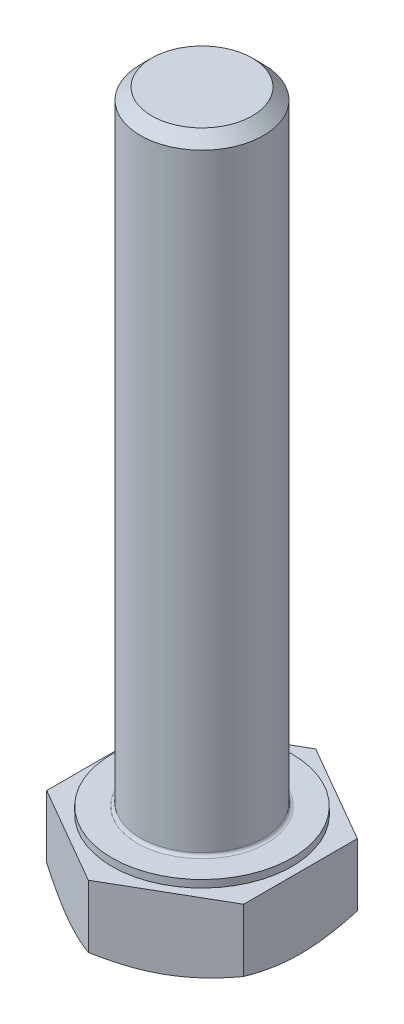
ISO-10303-21;
HEADER;
FILE_DESCRIPTION(('STEP AP214'),'2;1');
FILE_NAME('part.step','',(''),(''),'','','');
FILE_SCHEMA(('AUTOMOTIVE_DESIGN { 1 0 10303 214 1 1 1 1 }'));
ENDSEC;
DATA;
#1=APPLICATION_CONTEXT('core data for automotive mechanical design processes');
#2=APPLICATION_PROTOCOL_DEFINITION('international standard','automotive_design',2000,#1);
#3=PRODUCT_CONTEXT('',#1,'mechanical');
#4=PRODUCT('Part','Part','',(#3));
#5=PRODUCT_RELATED_PRODUCT_CATEGORY('part','',(#4));
#6=PRODUCT_DEFINITION_FORMATION('','',#4);
#7=PRODUCT_DEFINITION_CONTEXT('part definition',#1,'design');
#8=PRODUCT_DEFINITION('design','',#6,#7);
#9=PRODUCT_DEFINITION_SHAPE('','',#8);
#10=(LENGTH_UNIT() NAMED_UNIT(*) SI_UNIT(.MILLI.,.METRE.));
#11=(NAMED_UNIT(*) PLANE_ANGLE_UNIT() SI_UNIT($,.RADIAN.));
#12=(NAMED_UNIT(*) SI_UNIT($,.STERADIAN.) SOLID_ANGLE_UNIT());
#13=UNCERTAINTY_MEASURE_WITH_UNIT(LENGTH_MEASURE(1.E-05),#10,'distance_accuracy_value','');
#14=(GEOMETRIC_REPRESENTATION_CONTEXT(3) GLOBAL_UNCERTAINTY_ASSIGNED_CONTEXT((#13)) GLOBAL_UNIT_ASSIGNED_CONTEXT((#10,
#11,#12)) REPRESENTATION_CONTEXT('',''));
#15=CARTESIAN_POINT('',(0.,0.,0.));
#16=DIRECTION('',(0.,0.,1.));
#17=DIRECTION('',(1.,0.,0.));
#18=AXIS2_PLACEMENT_3D('',#15,#16,#17);
#19=CARTESIAN_POINT('',(8.,-6.4,0.));
#20=DIRECTION('',(0.,1.,0.));
#21=DIRECTION('',(0.,0.,1.));
#22=AXIS2_PLACEMENT_3D('',#19,#20,#21);
#23=PLANE('',#22);
#24=CARTESIAN_POINT('',(0.,-6.40000000000031,0.));
#25=DIRECTION('',(0.,1.,0.));
#26=DIRECTION('',(0.,0.,1.));
#27=AXIS2_PLACEMENT_3D('',#24,#25,#26);
#28=CIRCLE('',#27,8.0000000000382);
#29=CARTESIAN_POINT('',(4.00000000000951,-6.40000000001134,6.92820323029207));
#30=VERTEX_POINT('',#29);
#31=CARTESIAN_POINT('',(8.0000000000191,-6.40000000001134,0.));
#32=VERTEX_POINT('',#31);
#33=EDGE_CURVE('E96',#30,#32,#28,.T.);
#34=ORIENTED_EDGE('',*,*,#33,.F.);
#35=CARTESIAN_POINT('',(0.,-6.40000000000031,0.));
#36=DIRECTION('',(0.,1.,0.));
#37=DIRECTION('',(0.,0.,1.));
#38=AXIS2_PLACEMENT_3D('',#35,#36,#37);
#39=CIRCLE('',#38,8.0000000000382);
#40=CARTESIAN_POINT('',(-4.00000000000959,-6.40000000001134,6.92820323029203));
#41=VERTEX_POINT('',#40);
#42=EDGE_CURVE('E93',#41,#30,#39,.T.);
#43=ORIENTED_EDGE('',*,*,#42,.F.);
#44=CARTESIAN_POINT('',(0.,-6.40000000000031,0.));
#45=DIRECTION('',(0.,1.,0.));
#46=DIRECTION('',(0.,0.,1.));
#47=AXIS2_PLACEMENT_3D('',#44,#45,#46);
#48=CIRCLE('',#47,8.0000000000382);
#49=CARTESIAN_POINT('',(-8.0000000000191,-6.40000000001134,0.));
#50=VERTEX_POINT('',#49);
#51=EDGE_CURVE('E113',#50,#41,#48,.T.);
#52=ORIENTED_EDGE('',*,*,#51,.F.);
#53=CARTESIAN_POINT('',(0.,-6.40000000000031,0.));
#54=DIRECTION('',(0.,1.,0.));
#55=DIRECTION('',(0.,0.,1.));
#56=AXIS2_PLACEMENT_3D('',#53,#54,#55);
#57=CIRCLE('',#56,8.0000000000382);
#58=CARTESIAN_POINT('',(-4.00000000000951,-6.40000000001134,-6.92820323029207));
#59=VERTEX_POINT('',#58);
#60=EDGE_CURVE('E388',#59,#50,#57,.T.);
#61=ORIENTED_EDGE('',*,*,#60,.F.);
#62=CARTESIAN_POINT('',(0.,-6.40000000000031,0.));
#63=DIRECTION('',(0.,1.,0.));
#64=DIRECTION('',(0.,0.,1.));
#65=AXIS2_PLACEMENT_3D('',#62,#63,#64);
#66=CIRCLE('',#65,8.0000000000382);
#67=CARTESIAN_POINT('',(4.00000000000952,-6.40000000001134,-6.92820323029207));
#68=VERTEX_POINT('',#67);
#69=EDGE_CURVE('E102',#68,#59,#66,.T.);
#70=ORIENTED_EDGE('',*,*,#69,.F.);
#71=CARTESIAN_POINT('',(0.,-6.40000000000031,0.));
#72=DIRECTION('',(0.,1.,0.));
#73=DIRECTION('',(0.,0.,1.));
#74=AXIS2_PLACEMENT_3D('',#71,#72,#73);
#75=CIRCLE('',#74,8.0000000000382);
#76=EDGE_CURVE('E98',#32,#68,#75,.T.);
#77=ORIENTED_EDGE('',*,*,#76,.F.);
#78=EDGE_LOOP('',(#34,#43,#52,#61,#70,#77));
#79=FACE_BOUND('',#78,.T.);
#80=ADVANCED_FACE('F17',(#79),#23,.F.);
#81=CARTESIAN_POINT('',(0.,-5.68118163317877,0.));
#82=DIRECTION('',(0.,1.,0.));
#83=DIRECTION('',(0.,0.,1.));
#84=AXIS2_PLACEMENT_3D('',#81,#82,#83);
#85=CONICAL_SURFACE('',#84,9.2450299327993,1.04719755120094);
#86=CARTESIAN_POINT('',(-4.00000000000061,-6.40000000002302,6.92820323027648));
#87=CARTESIAN_POINT('',(-3.8302224396551,-6.4000326957245,7.02622435044347));
#88=CARTESIAN_POINT('',(-3.66045305807051,-6.39584033527235,7.12424074860114));
#89=CARTESIAN_POINT('',(-3.32124763949224,-6.37924851321016,7.32008108832763));
#90=CARTESIAN_POINT('',(-3.1518115431657,-6.36685067634699,7.41790506415229));
#91=CARTESIAN_POINT('',(-2.81436711781836,-6.33417255180148,7.61272869396319));
#92=CARTESIAN_POINT('',(-2.64635588452981,-6.31393194613933,7.70973002472919));
#93=CARTESIAN_POINT('',(-2.31113388158921,-6.2660036671677,7.90327053836521));
#94=CARTESIAN_POINT('',(-2.14392313312445,-6.23831579784059,7.99980970900275));
#95=CARTESIAN_POINT('',(-1.64418471740936,-6.14493664551292,8.28833381784026));
#96=CARTESIAN_POINT('',(-1.31310880898145,-6.068884475873,8.47948058269331));
#97=CARTESIAN_POINT('',(-0.653804099552734,-5.89348872052287,8.86013033415996));
#98=CARTESIAN_POINT('',(-0.325598295694732,-5.79402881345809,9.04962004336697));
#99=CARTESIAN_POINT('',(5.92127357109676E-12,-5.68546882021124,9.23760430703743));
#100=B_SPLINE_CURVE_WITH_KNOTS('',3,(#86,#87,#88,#89,#90,#91,#92,#93,#94,#95,#96,#97,#98,#99),
.UNSPECIFIED.,.F.,.F.,(4,2,2,2,2,2,4),(0.,0.588066701601263,1.17601699633505,1.76103049021487,
2.34605938360159,3.51458382204223,4.68904247546874),.UNSPECIFIED.);
#101=CARTESIAN_POINT('',(-3.37266926961453E-12,-5.68546882021209,9.23760430703596));
#102=VERTEX_POINT('',#101);
#103=EDGE_CURVE('E111',#41,#102,#100,.T.);
#104=ORIENTED_EDGE('',*,*,#103,.F.);
#105=ORIENTED_EDGE('',*,*,#42,.T.);
#106=CARTESIAN_POINT('',(-8.62483332197464E-12,-5.68546882020771,9.23760430703276));
#107=CARTESIAN_POINT('',(0.325598295693401,-5.79402881345675,9.04962004336556));
#108=CARTESIAN_POINT('',(0.653804099552006,-5.89348872052241,8.86013033415981));
#109=CARTESIAN_POINT('',(1.31310880898124,-6.06888447587321,8.47948058269399));
#110=CARTESIAN_POINT('',(1.64418471740907,-6.14493664551291,8.28833381784052));
#111=CARTESIAN_POINT('',(2.1439231331242,-6.23831579784053,7.99980970900284));
#112=CARTESIAN_POINT('',(2.31113388158899,-6.26600366716767,7.90327053836533));
#113=CARTESIAN_POINT('',(2.64635588452962,-6.31393194613931,7.7097300247293));
#114=CARTESIAN_POINT('',(2.81436711781817,-6.33417255180145,7.61272869396326));
#115=CARTESIAN_POINT('',(3.15181154316559,-6.36685067634699,7.41790506415238));
#116=CARTESIAN_POINT('',(3.3212476394922,-6.37924851321022,7.32008108832778));
#117=CARTESIAN_POINT('',(3.66045305807044,-6.39584033527229,7.12424074860105));
#118=CARTESIAN_POINT('',(3.83022243965493,-6.40003269572427,7.0262243504431));
#119=CARTESIAN_POINT('',(4.00000000000013,-6.40000000002237,6.92820323027544));
#120=B_SPLINE_CURVE_WITH_KNOTS('',3,(#106,#107,#108,#109,#110,#111,#112,#113,#114,#115,#116,
#117,#118,#119),.UNSPECIFIED.,.F.,.F.,(4,2,2,2,2,2,4),(0.,1.17445865342687,2.34298309186775,
2.92801198525453,3.5130254791344,4.1009757738683,4.68904247546972),.UNSPECIFIED.);
#121=EDGE_CURVE('E108',#102,#30,#120,.T.);
#122=ORIENTED_EDGE('',*,*,#121,.F.);
#123=EDGE_LOOP('',(#104,#105,#122));
#124=FACE_BOUND('',#123,.T.);
#125=ADVANCED_FACE('F106',(#124),#85,.T.);
#126=CARTESIAN_POINT('',(0.,-5.68118163317877,0.));
#127=DIRECTION('',(0.,1.,0.));
#128=DIRECTION('',(0.,0.,1.));
#129=AXIS2_PLACEMENT_3D('',#126,#127,#128);
#130=CONICAL_SURFACE('',#129,9.2450299327993,1.04719755120094);
#131=CARTESIAN_POINT('',(-8.00000000000114,-6.40000000002303,0.));
#132=CARTESIAN_POINT('',(-8.00000000000041,-6.4000326957245,0.196042240335185));
#133=CARTESIAN_POINT('',(-8.00000000000011,-6.39584033527235,0.39207503665105));
#134=CARTESIAN_POINT('',(-7.99999999999989,-6.37924851321016,0.783755716104415));
#135=CARTESIAN_POINT('',(-7.99999999999997,-6.36685067634699,0.979403667753599));
#136=CARTESIAN_POINT('',(-8.00000000000003,-6.33417255180148,1.36905092737529));
#137=CARTESIAN_POINT('',(-8.00000000000001,-6.31393194613933,1.56305358890733));
#138=CARTESIAN_POINT('',(-7.99999999999999,-6.26600366716771,1.95013461617941));
#139=CARTESIAN_POINT('',(-8.,-6.2383157978406,2.14321295745447));
#140=CARTESIAN_POINT('',(-8.00000000000001,-6.14493664551292,2.7202611751295));
#141=CARTESIAN_POINT('',(-8.,-6.068884475873,3.1025547048356));
#142=CARTESIAN_POINT('',(-8.,-5.89348872052286,3.86385420776893));
#143=CARTESIAN_POINT('',(-7.99999999999999,-5.79402881345808,4.24283362618296));
#144=CARTESIAN_POINT('',(-8.,-5.68546882021123,4.61880215352388));
#145=B_SPLINE_CURVE_WITH_KNOTS('',3,(#131,#132,#133,#134,#135,#136,#137,#138,#139,#140,#141,
#142,#143,#144),.UNSPECIFIED.,.F.,.F.,(4,2,2,2,2,2,4),(0.,0.588066701601272,1.17601699633507,
1.7610304902149,2.34605938360163,3.51458382204228,4.6890424754688),.UNSPECIFIED.);
#146=CARTESIAN_POINT('',(-8.00000000000338,-5.68546882021208,4.61880215351506));
#147=VERTEX_POINT('',#146);
#148=EDGE_CURVE('E176',#50,#147,#145,.T.);
#149=ORIENTED_EDGE('',*,*,#148,.F.);
#150=ORIENTED_EDGE('',*,*,#51,.T.);
#151=CARTESIAN_POINT('',(-8.00000000000324,-5.68546882020768,4.61880215350888));
#152=CARTESIAN_POINT('',(-7.67440170430473,-5.79402881345673,4.80678641718217));
#153=CARTESIAN_POINT('',(-7.34619590044752,-5.8934887205224,4.99627612639034));
#154=CARTESIAN_POINT('',(-6.68689119101927,-6.06888447587321,5.37692587785788));
#155=CARTESIAN_POINT('',(-6.35581528259104,-6.1449366455129,5.56807264271065));
#156=CARTESIAN_POINT('',(-5.85607686687577,-6.23831579784053,5.8565967515481));
#157=CARTESIAN_POINT('',(-5.68886611841101,-6.26600366716767,5.95313592218567));
#158=CARTESIAN_POINT('',(-5.3536441154704,-6.31393194613931,6.14667643582174));
#159=CARTESIAN_POINT('',(-5.18563288218184,-6.33417255180145,6.24367776658776));
#160=CARTESIAN_POINT('',(-4.84818845683441,-6.36685067634699,6.43850139639863));
#161=CARTESIAN_POINT('',(-4.6787523605078,-6.37924851321021,6.53632537222324));
#162=CARTESIAN_POINT('',(-4.33954694192956,-6.39584033527229,6.73216571194997));
#163=CARTESIAN_POINT('',(-4.16977756034508,-6.40003269572426,6.83018211010793));
#164=CARTESIAN_POINT('',(-3.99999999999988,-6.40000000002237,6.92820323027559));
#165=B_SPLINE_CURVE_WITH_KNOTS('',3,(#151,#152,#153,#154,#155,#156,#157,#158,#159,#160,#161,
#162,#163,#164),.UNSPECIFIED.,.F.,.F.,(4,2,2,2,2,2,4),(0.,1.17445865342687,2.34298309186776,
2.92801198525455,3.51302547913442,4.10097577386833,4.68904247546975),.UNSPECIFIED.);
#166=EDGE_CURVE('E122',#147,#41,#165,.T.);
#167=ORIENTED_EDGE('',*,*,#166,.F.);
#168=EDGE_LOOP('',(#149,#150,#167));
#169=FACE_BOUND('',#168,.T.);
#170=ADVANCED_FACE('F144',(#169),#130,.T.);
#171=CARTESIAN_POINT('',(0.,-5.68118163317877,0.));
#172=DIRECTION('',(0.,1.,0.));
#173=DIRECTION('',(0.,0.,1.));
#174=AXIS2_PLACEMENT_3D('',#171,#172,#173);
#175=CONICAL_SURFACE('',#174,9.2450299327993,1.04719755120094);
#176=ORIENTED_EDGE('',*,*,#60,.T.);
#177=CARTESIAN_POINT('',(-7.99999999999453,-5.68546882020763,-4.61880215352393));
#178=CARTESIAN_POINT('',(-7.99999999999809,-5.79402881345671,-4.24283362618347));
#179=CARTESIAN_POINT('',(-7.9999999999995,-5.89348872052239,-3.86385420776954));
#180=CARTESIAN_POINT('',(-8.0000000000005,-6.0688844758732,-3.10255470483618));
#181=CARTESIAN_POINT('',(-8.00000000000009,-6.1449366455129,-2.72026117512994));
#182=CARTESIAN_POINT('',(-7.99999999999995,-6.23831579784052,-2.14321295745479));
#183=CARTESIAN_POINT('',(-7.99999999999999,-6.26600366716766,-1.95013461617972));
#184=CARTESIAN_POINT('',(-8.00000000000001,-6.3139319461393,-1.56305358890761));
#185=CARTESIAN_POINT('',(-8.,-6.33417255180144,-1.36905092737555));
#186=CARTESIAN_POINT('',(-8.,-6.36685067634699,-0.979403667753801));
#187=CARTESIAN_POINT('',(-8.,-6.37924851321021,-0.783755716104578));
#188=CARTESIAN_POINT('',(-8.,-6.39584033527229,-0.392075036651121));
#189=CARTESIAN_POINT('',(-8.,-6.40003269572427,-0.196042240335201));
#190=CARTESIAN_POINT('',(-8.,-6.40000000002237,1.17599260521062E-13));
#191=B_SPLINE_CURVE_WITH_KNOTS('',3,(#177,#178,#179,#180,#181,#182,#183,#184,#185,#186,#187,
#188,#189,#190),.UNSPECIFIED.,.F.,.F.,(4,2,2,2,2,2,4),(0.,1.17445865342689,2.34298309186778,
2.92801198525458,3.51302547913445,4.10097577386836,4.68904247546979),.UNSPECIFIED.);
#192=CARTESIAN_POINT('',(-8.,-5.68546882021208,-4.61880215352095));
#193=VERTEX_POINT('',#192);
#194=EDGE_CURVE('E153',#193,#50,#191,.T.);
#195=ORIENTED_EDGE('',*,*,#194,.F.);
#196=CARTESIAN_POINT('',(-4.00000000000053,-6.40000000002303,-6.92820323027651));
#197=CARTESIAN_POINT('',(-4.16977756034531,-6.4000326957245,-6.83018211010825));
#198=CARTESIAN_POINT('',(-4.33954694192961,-6.39584033527235,-6.73216571195006));
#199=CARTESIAN_POINT('',(-4.67875236050766,-6.37924851321016,-6.53632537222319));
#200=CARTESIAN_POINT('',(-4.84818845683428,-6.36685067634699,-6.43850139639867));
#201=CARTESIAN_POINT('',(-5.18563288218169,-6.33417255180148,-6.24367776658787));
#202=CARTESIAN_POINT('',(-5.35364411547022,-6.31393194613933,-6.14667643582183));
#203=CARTESIAN_POINT('',(-5.68886611841082,-6.2660036671677,-5.95313592218577));
#204=CARTESIAN_POINT('',(-5.85607686687558,-6.23831579784059,-5.85659675154825));
#205=CARTESIAN_POINT('',(-6.35581528259069,-6.14493664551291,-5.56807264271074));
#206=CARTESIAN_POINT('',(-6.6868911910186,-6.068884475873,-5.37692587785769));
#207=CARTESIAN_POINT('',(-7.34619590044732,-5.89348872052285,-4.99627612639102));
#208=CARTESIAN_POINT('',(-7.67440170430532,-5.79402881345807,-4.806786417184));
#209=CARTESIAN_POINT('',(-8.00000000000599,-5.68546882021122,-4.61880215351355));
#210=B_SPLINE_CURVE_WITH_KNOTS('',3,(#196,#197,#198,#199,#200,#201,#202,#203,#204,#205,#206,
#207,#208,#209),.UNSPECIFIED.,.F.,.F.,(4,2,2,2,2,2,4),(0.,0.588066701601274,1.17601699633507,
1.7610304902149,2.34605938360163,3.51458382204229,4.68904247546881),.UNSPECIFIED.);
#211=EDGE_CURVE('E190',#59,#193,#210,.T.);
#212=ORIENTED_EDGE('',*,*,#211,.F.);
#213=EDGE_LOOP('',(#176,#195,#212));
#214=FACE_BOUND('',#213,.T.);
#215=ADVANCED_FACE('F198',(#214),#175,.T.);
#216=CARTESIAN_POINT('',(0.,-5.68118163317877,0.));
#217=DIRECTION('',(0.,1.,0.));
#218=DIRECTION('',(0.,0.,1.));
#219=AXIS2_PLACEMENT_3D('',#216,#217,#218);
#220=CONICAL_SURFACE('',#219,9.2450299327993,1.04719755120094);
#221=ORIENTED_EDGE('',*,*,#69,.T.);
#222=CARTESIAN_POINT('',(8.77798779563216E-12,-5.68546882020761,-9.23760430703274));
#223=CARTESIAN_POINT('',(-0.325598295693279,-5.79402881345669,-9.04962004336559));
#224=CARTESIAN_POINT('',(-0.653804099551903,-5.89348872052238,-8.86013033415986));
#225=CARTESIAN_POINT('',(-1.31310880898117,-6.0688844758732,-8.47948058269404));
#226=CARTESIAN_POINT('',(-1.644184717409,-6.14493664551289,-8.28833381784056));
#227=CARTESIAN_POINT('',(-2.14392313312415,-6.23831579784052,-7.99980970900287));
#228=CARTESIAN_POINT('',(-2.31113388158894,-6.26600366716766,-7.90327053836536));
#229=CARTESIAN_POINT('',(-2.64635588452958,-6.3139319461393,-7.70973002472932));
#230=CARTESIAN_POINT('',(-2.81436711781814,-6.33417255180145,-7.61272869396328));
#231=CARTESIAN_POINT('',(-3.15181154316556,-6.36685067634699,-7.4179050641524));
#232=CARTESIAN_POINT('',(-3.32124763949218,-6.37924851321022,-7.32008108832779));
#233=CARTESIAN_POINT('',(-3.66045305807043,-6.39584033527229,-7.12424074860106));
#234=CARTESIAN_POINT('',(-3.83022243965493,-6.40003269572427,-7.0262243504431));
#235=CARTESIAN_POINT('',(-4.00000000000013,-6.40000000002237,-6.92820323027543));
#236=B_SPLINE_CURVE_WITH_KNOTS('',3,(#222,#223,#224,#225,#226,#227,#228,#229,#230,#231,#232,
#233,#234,#235),.UNSPECIFIED.,.F.,.F.,(4,2,2,2,2,2,4),(0.,1.1744586534269,2.34298309186782,
2.92801198525462,3.51302547913451,4.10097577386843,4.68904247546986),.UNSPECIFIED.);
#237=CARTESIAN_POINT('',(3.48340202598975E-12,-5.68546882021209,-9.23760430703596));
#238=VERTEX_POINT('',#237);
#239=EDGE_CURVE('E183',#238,#59,#236,.T.);
#240=ORIENTED_EDGE('',*,*,#239,.F.);
#241=CARTESIAN_POINT('',(4.00000000000054,-6.40000000002302,-6.92820323027652));
#242=CARTESIAN_POINT('',(3.83022243965503,-6.4000326957245,-7.02622435044351));
#243=CARTESIAN_POINT('',(3.66045305807045,-6.39584033527235,-7.12424074860118));
#244=CARTESIAN_POINT('',(3.32124763949218,-6.37924851321015,-7.32008108832767));
#245=CARTESIAN_POINT('',(3.15181154316565,-6.36685067634698,-7.41790506415233));
#246=CARTESIAN_POINT('',(2.81436711781831,-6.33417255180147,-7.61272869396322));
#247=CARTESIAN_POINT('',(2.64635588452976,-6.31393194613932,-7.70973002472922));
#248=CARTESIAN_POINT('',(2.31113388158917,-6.2660036671677,-7.90327053836524));
#249=CARTESIAN_POINT('',(2.14392313312441,-6.23831579784059,-7.99980970900277));
#250=CARTESIAN_POINT('',(1.64418471740933,-6.14493664551291,-8.28833381784028));
#251=CARTESIAN_POINT('',(1.31310880898143,-6.068884475873,-8.47948058269332));
#252=CARTESIAN_POINT('',(0.653804099552722,-5.89348872052286,-8.86013033415997));
#253=CARTESIAN_POINT('',(0.325598295694726,-5.79402881345809,-9.04962004336697));
#254=CARTESIAN_POINT('',(-5.92109388879758E-12,-5.68546882021124,-9.23760430703743));
#255=B_SPLINE_CURVE_WITH_KNOTS('',3,(#241,#242,#243,#244,#245,#246,#247,#248,#249,#250,#251,
#252,#253,#254),.UNSPECIFIED.,.F.,.F.,(4,2,2,2,2,2,4),(0.,0.588066701601253,1.17601699633503,
1.76103049021484,2.34605938360155,3.51458382204217,4.68904247546866),.UNSPECIFIED.);
#256=EDGE_CURVE('E204',#68,#238,#255,.T.);
#257=ORIENTED_EDGE('',*,*,#256,.F.);
#258=EDGE_LOOP('',(#221,#240,#257));
#259=FACE_BOUND('',#258,.T.);
#260=ADVANCED_FACE('F195',(#259),#220,.T.);
#261=CARTESIAN_POINT('',(0.,-5.68118163317877,0.));
#262=DIRECTION('',(0.,1.,0.));
#263=DIRECTION('',(0.,0.,1.));
#264=AXIS2_PLACEMENT_3D('',#261,#262,#263);
#265=CONICAL_SURFACE('',#264,9.2450299327993,1.04719755120094);
#266=CARTESIAN_POINT('',(4.00000000000053,-6.40000000002303,6.92820323027652));
#267=CARTESIAN_POINT('',(4.16977756034531,-6.4000326957245,6.83018211010826));
#268=CARTESIAN_POINT('',(4.3395469419296,-6.39584033527235,6.73216571195006));
#269=CARTESIAN_POINT('',(4.67875236050766,-6.37924851321016,6.53632537222319));
#270=CARTESIAN_POINT('',(4.84818845683428,-6.36685067634699,6.43850139639867));
#271=CARTESIAN_POINT('',(5.18563288218168,-6.33417255180148,6.24367776658787));
#272=CARTESIAN_POINT('',(5.35364411547022,-6.31393194613933,6.14667643582183));
#273=CARTESIAN_POINT('',(5.68886611841081,-6.2660036671677,5.95313592218578));
#274=CARTESIAN_POINT('',(5.85607686687557,-6.23831579784059,5.85659675154826));
#275=CARTESIAN_POINT('',(6.35581528259068,-6.14493664551291,5.56807264271075));
#276=CARTESIAN_POINT('',(6.68689119101859,-6.068884475873,5.3769258778577));
#277=CARTESIAN_POINT('',(7.3461959004473,-5.89348872052286,4.99627612639103));
#278=CARTESIAN_POINT('',(7.67440170430531,-5.79402881345808,4.80678641718401));
#279=CARTESIAN_POINT('',(8.00000000000597,-5.68546882021122,4.61880215351356));
#280=B_SPLINE_CURVE_WITH_KNOTS('',3,(#266,#267,#268,#269,#270,#271,#272,#273,#274,#275,#276,
#277,#278,#279),.UNSPECIFIED.,.F.,.F.,(4,2,2,2,2,2,4),(0.,0.588066701601272,1.17601699633507,
1.7610304902149,2.34605938360162,3.51458382204228,4.6890424754688),.UNSPECIFIED.);
#281=CARTESIAN_POINT('',(8.0000000000034,-5.68546882021095,4.61880215351897));
#282=VERTEX_POINT('',#281);
#283=EDGE_CURVE('E116',#30,#282,#280,.T.);
#284=ORIENTED_EDGE('',*,*,#283,.F.);
#285=ORIENTED_EDGE('',*,*,#33,.T.);
#286=CARTESIAN_POINT('',(7.99999999999456,-5.68546882020766,4.6188021535239));
#287=CARTESIAN_POINT('',(7.9999999999981,-5.79402881345673,4.24283362618342));
#288=CARTESIAN_POINT('',(7.9999999999995,-5.8934887205224,3.86385420776949));
#289=CARTESIAN_POINT('',(8.00000000000049,-6.06888447587321,3.10255470483611));
#290=CARTESIAN_POINT('',(8.00000000000009,-6.14493664551291,2.72026117512986));
#291=CARTESIAN_POINT('',(7.99999999999995,-6.23831579784054,2.1432129574547));
#292=CARTESIAN_POINT('',(7.99999999999999,-6.26600366716768,1.95013461617962));
#293=CARTESIAN_POINT('',(8.00000000000001,-6.31393194613932,1.5630535889075));
#294=CARTESIAN_POINT('',(8.,-6.33417255180145,1.36905092737543));
#295=CARTESIAN_POINT('',(8.,-6.366850676347,0.979403667753676));
#296=CARTESIAN_POINT('',(8.,-6.37924851321022,0.783755716104449));
#297=CARTESIAN_POINT('',(8.,-6.39584033527229,0.392075036650982));
#298=CARTESIAN_POINT('',(8.,-6.40003269572427,0.196042240335057));
#299=CARTESIAN_POINT('',(8.,-6.40000000002237,-2.66702787859452E-13));
#300=B_SPLINE_CURVE_WITH_KNOTS('',3,(#286,#287,#288,#289,#290,#291,#292,#293,#294,#295,#296,
#297,#298,#299),.UNSPECIFIED.,.F.,.F.,(4,2,2,2,2,2,4),(0.,1.17445865342691,2.34298309186784,
2.92801198525464,3.51302547913454,4.10097577386846,4.6890424754699),.UNSPECIFIED.);
#301=EDGE_CURVE('E119',#282,#32,#300,.T.);
#302=ORIENTED_EDGE('',*,*,#301,.F.);
#303=EDGE_LOOP('',(#284,#285,#302));
#304=FACE_BOUND('',#303,.T.);
#305=ADVANCED_FACE('F117',(#304),#265,.T.);
#306=CARTESIAN_POINT('',(0.,-5.68118163317877,0.));
#307=DIRECTION('',(0.,1.,0.));
#308=DIRECTION('',(0.,0.,1.));
#309=AXIS2_PLACEMENT_3D('',#306,#307,#308);
#310=CONICAL_SURFACE('',#309,9.2450299327993,1.04719755120094);
#311=ORIENTED_EDGE('',*,*,#76,.T.);
#312=CARTESIAN_POINT('',(8.00000000000324,-5.68546882020768,-4.61880215350889));
#313=CARTESIAN_POINT('',(7.67440170430472,-5.79402881345674,-4.80678641718218));
#314=CARTESIAN_POINT('',(7.34619590044751,-5.89348872052241,-4.99627612639035));
#315=CARTESIAN_POINT('',(6.68689119101924,-6.06888447587321,-5.37692587785789));
#316=CARTESIAN_POINT('',(6.35581528259101,-6.14493664551291,-5.56807264271066));
#317=CARTESIAN_POINT('',(5.85607686687573,-6.23831579784053,-5.85659675154812));
#318=CARTESIAN_POINT('',(5.68886611841097,-6.26600366716767,-5.95313592218569));
#319=CARTESIAN_POINT('',(5.35364411547035,-6.31393194613931,-6.14667643582177));
#320=CARTESIAN_POINT('',(5.18563288218179,-6.33417255180145,-6.24367776658779));
#321=CARTESIAN_POINT('',(4.84818845683436,-6.366850676347,-6.43850139639866));
#322=CARTESIAN_POINT('',(4.67875236050774,-6.37924851321022,-6.53632537222327));
#323=CARTESIAN_POINT('',(4.3395469419295,-6.39584033527229,-6.73216571195001));
#324=CARTESIAN_POINT('',(4.16977756034501,-6.40003269572426,-6.83018211010797));
#325=CARTESIAN_POINT('',(3.99999999999981,-6.40000000002237,-6.92820323027563));
#326=B_SPLINE_CURVE_WITH_KNOTS('',3,(#312,#313,#314,#315,#316,#317,#318,#319,#320,#321,#322,
#323,#324,#325),.UNSPECIFIED.,.F.,.F.,(4,2,2,2,2,2,4),(0.,1.17445865342689,2.3429830918678,
2.9280119852546,3.51302547913448,4.10097577386839,4.68904247546983),.UNSPECIFIED.);
#327=CARTESIAN_POINT('',(8.00000000000338,-5.68546882021209,-4.61880215351506));
#328=VERTEX_POINT('',#327);
#329=EDGE_CURVE('E211',#328,#68,#326,.T.);
#330=ORIENTED_EDGE('',*,*,#329,.F.);
#331=CARTESIAN_POINT('',(8.00000000000114,-6.40000000002303,0.));
#332=CARTESIAN_POINT('',(8.00000000000041,-6.4000326957245,-0.196042240335326));
#333=CARTESIAN_POINT('',(8.00000000000011,-6.39584033527235,-0.392075036651186));
#334=CARTESIAN_POINT('',(7.99999999999989,-6.37924851321015,-0.783755716104538));
#335=CARTESIAN_POINT('',(7.99999999999997,-6.36685067634698,-0.979403667753715));
#336=CARTESIAN_POINT('',(8.00000000000003,-6.33417255180147,-1.3690509273754));
#337=CARTESIAN_POINT('',(8.00000000000001,-6.31393194613932,-1.56305358890743));
#338=CARTESIAN_POINT('',(7.99999999999999,-6.26600366716769,-1.9501346161795));
#339=CARTESIAN_POINT('',(8.,-6.23831579784058,-2.14321295745455));
#340=CARTESIAN_POINT('',(8.00000000000001,-6.14493664551291,-2.72026117512956));
#341=CARTESIAN_POINT('',(8.,-6.06888447587299,-3.10255470483565));
#342=CARTESIAN_POINT('',(8.,-5.89348872052285,-3.86385420776895));
#343=CARTESIAN_POINT('',(7.99999999999999,-5.79402881345808,-4.24283362618297));
#344=CARTESIAN_POINT('',(8.,-5.68546882021123,-4.61880215352388));
#345=B_SPLINE_CURVE_WITH_KNOTS('',3,(#331,#332,#333,#334,#335,#336,#337,#338,#339,#340,#341,
#342,#343,#344),.UNSPECIFIED.,.F.,.F.,(4,2,2,2,2,2,4),(0.,0.588066701601253,1.17601699633503,
1.76103049021484,2.34605938360155,3.51458382204217,4.68904247546865),.UNSPECIFIED.);
#346=EDGE_CURVE('E233',#32,#328,#345,.T.);
#347=ORIENTED_EDGE('',*,*,#346,.F.);
#348=EDGE_LOOP('',(#311,#330,#347));
#349=FACE_BOUND('',#348,.T.);
#350=ADVANCED_FACE('F242',(#349),#310,.T.);
#351=CARTESIAN_POINT('',(0.,-7.,9.23760430703401));
#352=DIRECTION('',(0.5,0.,0.866025403784439));
#353=DIRECTION('',(0.866025403784439,0.,-0.5));
#354=AXIS2_PLACEMENT_3D('',#351,#352,#353);
#355=PLANE('',#354);
#356=DIRECTION('',(-0.866025403784439,0.,0.499999999999999));
#357=VECTOR('',#356,1.);
#358=CARTESIAN_POINT('',(8.,-0.600000000000004,4.61880215351701));
#359=LINE('',#358,#357);
#360=CARTESIAN_POINT('',(8.,-0.600000000000004,4.61880215351701));
#361=VERTEX_POINT('',#360);
#362=CARTESIAN_POINT('',(0.,-0.600000000000003,9.23760430703401));
#363=VERTEX_POINT('',#362);
#364=EDGE_CURVE('E308',#361,#363,#359,.T.);
#365=ORIENTED_EDGE('',*,*,#364,.T.);
#366=DIRECTION('',(0.,1.,0.));
#367=VECTOR('',#366,1.);
#368=CARTESIAN_POINT('',(0.,-7.,9.23760430703401));
#369=LINE('',#368,#367);
#370=EDGE_CURVE('E126',#102,#363,#369,.T.);
#371=ORIENTED_EDGE('',*,*,#370,.F.);
#372=ORIENTED_EDGE('',*,*,#121,.T.);
#373=ORIENTED_EDGE('',*,*,#283,.T.);
#374=DIRECTION('',(0.,1.,0.));
#375=VECTOR('',#374,1.);
#376=CARTESIAN_POINT('',(8.,-7.,4.61880215351701));
#377=LINE('',#376,#375);
#378=EDGE_CURVE('E306',#361,#282,#377,.F.);
#379=ORIENTED_EDGE('',*,*,#378,.F.);
#380=EDGE_LOOP('',(#365,#371,#372,#373,#379));
#381=FACE_BOUND('',#380,.T.);
#382=ADVANCED_FACE('F124',(#381),#355,.T.);
#383=CARTESIAN_POINT('',(-8.,-7.,4.61880215351701));
#384=DIRECTION('',(-0.5,0.,0.866025403784439));
#385=DIRECTION('',(0.866025403784439,0.,0.5));
#386=AXIS2_PLACEMENT_3D('',#383,#384,#385);
#387=PLANE('',#386);
#388=DIRECTION('',(-0.866025403784439,0.,-0.5));
#389=VECTOR('',#388,1.);
#390=CARTESIAN_POINT('',(0.,-0.600000000000004,9.23760430703401));
#391=LINE('',#390,#389);
#392=CARTESIAN_POINT('',(-8.,-0.600000000000002,4.61880215351701));
#393=VERTEX_POINT('',#392);
#394=EDGE_CURVE('E338',#363,#393,#391,.T.);
#395=ORIENTED_EDGE('',*,*,#394,.T.);
#396=DIRECTION('',(0.,1.,0.));
#397=VECTOR('',#396,1.);
#398=CARTESIAN_POINT('',(-8.,-7.,4.61880215351701));
#399=LINE('',#398,#397);
#400=EDGE_CURVE('E182',#147,#393,#399,.T.);
#401=ORIENTED_EDGE('',*,*,#400,.F.);
#402=ORIENTED_EDGE('',*,*,#166,.T.);
#403=ORIENTED_EDGE('',*,*,#103,.T.);
#404=ORIENTED_EDGE('',*,*,#370,.T.);
#405=EDGE_LOOP('',(#395,#401,#402,#403,#404));
#406=FACE_BOUND('',#405,.T.);
#407=ADVANCED_FACE('F162',(#406),#387,.T.);
#408=CARTESIAN_POINT('',(-8.,-7.,-4.61880215351701));
#409=DIRECTION('',(-1.,0.,0.));
#410=DIRECTION('',(0.,0.,1.));
#411=AXIS2_PLACEMENT_3D('',#408,#409,#410);
#412=PLANE('',#411);
#413=DIRECTION('',(0.,0.,-1.));
#414=VECTOR('',#413,1.);
#415=CARTESIAN_POINT('',(-8.,-0.600000000000004,0.));
#416=LINE('',#415,#414);
#417=CARTESIAN_POINT('',(-8.,-0.600000000000001,-4.61880215351701));
#418=VERTEX_POINT('',#417);
#419=EDGE_CURVE('E346',#393,#418,#416,.T.);
#420=ORIENTED_EDGE('',*,*,#419,.T.);
#421=DIRECTION('',(0.,1.,0.));
#422=VECTOR('',#421,1.);
#423=CARTESIAN_POINT('',(-7.99999999999999,-7.,-4.61880215351701));
#424=LINE('',#423,#422);
#425=EDGE_CURVE('E319',#193,#418,#424,.T.);
#426=ORIENTED_EDGE('',*,*,#425,.F.);
#427=ORIENTED_EDGE('',*,*,#194,.T.);
#428=ORIENTED_EDGE('',*,*,#148,.T.);
#429=ORIENTED_EDGE('',*,*,#400,.T.);
#430=EDGE_LOOP('',(#420,#426,#427,#428,#429));
#431=FACE_BOUND('',#430,.T.);
#432=ADVANCED_FACE('F165',(#431),#412,.T.);
#433=CARTESIAN_POINT('',(0.,-7.,-9.23760430703401));
#434=DIRECTION('',(-0.5,0.,-0.866025403784439));
#435=DIRECTION('',(-0.866025403784439,0.,0.5));
#436=AXIS2_PLACEMENT_3D('',#433,#434,#435);
#437=PLANE('',#436);
#438=DIRECTION('',(0.866025403784439,0.,-0.499999999999999));
#439=VECTOR('',#438,1.);
#440=CARTESIAN_POINT('',(-8.,-0.600000000000004,-4.61880215351701));
#441=LINE('',#440,#439);
#442=CARTESIAN_POINT('',(0.,-0.600000000000001,-9.23760430703397));
#443=VERTEX_POINT('',#442);
#444=EDGE_CURVE('E342',#418,#443,#441,.T.);
#445=ORIENTED_EDGE('',*,*,#444,.T.);
#446=DIRECTION('',(0.,1.,0.));
#447=VECTOR('',#446,1.);
#448=CARTESIAN_POINT('',(1.04083408558608E-13,-7.,-9.23760430703395));
#449=LINE('',#448,#447);
#450=EDGE_CURVE('E210',#238,#443,#449,.T.);
#451=ORIENTED_EDGE('',*,*,#450,.F.);
#452=ORIENTED_EDGE('',*,*,#239,.T.);
#453=ORIENTED_EDGE('',*,*,#211,.T.);
#454=ORIENTED_EDGE('',*,*,#425,.T.);
#455=EDGE_LOOP('',(#445,#451,#452,#453,#454));
#456=FACE_BOUND('',#455,.T.);
#457=ADVANCED_FACE('F171',(#456),#437,.T.);
#458=CARTESIAN_POINT('',(8.,-7.,-4.61880215351701));
#459=DIRECTION('',(0.5,0.,-0.866025403784439));
#460=DIRECTION('',(-0.866025403784439,0.,-0.5));
#461=AXIS2_PLACEMENT_3D('',#458,#459,#460);
#462=PLANE('',#461);
#463=DIRECTION('',(0.866025403784439,0.,0.5));
#464=VECTOR('',#463,1.);
#465=CARTESIAN_POINT('',(0.,-0.600000000000004,-9.23760430703401));
#466=LINE('',#465,#464);
#467=CARTESIAN_POINT('',(8.,-0.600000000000004,-4.61880215351701));
#468=VERTEX_POINT('',#467);
#469=EDGE_CURVE('E334',#443,#468,#466,.T.);
#470=ORIENTED_EDGE('',*,*,#469,.T.);
#471=DIRECTION('',(0.,1.,0.));
#472=VECTOR('',#471,1.);
#473=CARTESIAN_POINT('',(8.,-7.,-4.61880215351701));
#474=LINE('',#473,#472);
#475=EDGE_CURVE('E239',#328,#468,#474,.T.);
#476=ORIENTED_EDGE('',*,*,#475,.F.);
#477=ORIENTED_EDGE('',*,*,#329,.T.);
#478=ORIENTED_EDGE('',*,*,#256,.T.);
#479=ORIENTED_EDGE('',*,*,#450,.T.);
#480=EDGE_LOOP('',(#470,#476,#477,#478,#479));
#481=FACE_BOUND('',#480,.T.);
#482=ADVANCED_FACE('F220',(#481),#462,.T.);
#483=CARTESIAN_POINT('',(8.,-7.,4.61880215351701));
#484=DIRECTION('',(1.,0.,0.));
#485=DIRECTION('',(0.,0.,-1.));
#486=AXIS2_PLACEMENT_3D('',#483,#484,#485);
#487=PLANE('',#486);
#488=DIRECTION('',(0.,0.,-1.));
#489=VECTOR('',#488,1.);
#490=CARTESIAN_POINT('',(8.,-0.600000000000004,0.));
#491=LINE('',#490,#489);
#492=EDGE_CURVE('E331',#468,#361,#491,.F.);
#493=ORIENTED_EDGE('',*,*,#492,.T.);
#494=ORIENTED_EDGE('',*,*,#378,.T.);
#495=ORIENTED_EDGE('',*,*,#301,.T.);
#496=ORIENTED_EDGE('',*,*,#346,.T.);
#497=ORIENTED_EDGE('',*,*,#475,.T.);
#498=EDGE_LOOP('',(#493,#494,#495,#496,#497));
#499=FACE_BOUND('',#498,.T.);
#500=ADVANCED_FACE('F223',(#499),#487,.T.);
#501=CARTESIAN_POINT('',(0.,-0.600000000000004,0.));
#502=DIRECTION('',(0.,-1.,0.));
#503=DIRECTION('',(0.,0.,-1.));
#504=AXIS2_PLACEMENT_3D('',#501,#502,#503);
#505=PLANE('',#504);
#506=CARTESIAN_POINT('',(0.,-0.600000000000004,0.));
#507=DIRECTION('',(0.,1.,0.));
#508=DIRECTION('',(0.,0.,1.));
#509=AXIS2_PLACEMENT_3D('',#506,#507,#508);
#510=CIRCLE('',#509,7.315);
#511=CARTESIAN_POINT('',(0.,-0.600000000000004,7.315));
#512=VERTEX_POINT('',#511);
#513=EDGE_CURVE('E240',#512,#512,#510,.T.);
#514=ORIENTED_EDGE('',*,*,#513,.F.);
#515=EDGE_LOOP('',(#514));
#516=FACE_BOUND('',#515,.T.);
#517=ORIENTED_EDGE('',*,*,#469,.F.);
#518=ORIENTED_EDGE('',*,*,#444,.F.);
#519=ORIENTED_EDGE('',*,*,#419,.F.);
#520=ORIENTED_EDGE('',*,*,#394,.F.);
#521=ORIENTED_EDGE('',*,*,#364,.F.);
#522=ORIENTED_EDGE('',*,*,#492,.F.);
#523=EDGE_LOOP('',(#517,#518,#519,#520,#521,#522));
#524=FACE_BOUND('',#523,.T.);
#525=ADVANCED_FACE('F229',(#516,#524),#505,.F.);
#526=CARTESIAN_POINT('',(0.,-0.6,0.));
#527=DIRECTION('',(0.,1.,0.));
#528=DIRECTION('',(0.,0.,1.));
#529=AXIS2_PLACEMENT_3D('',#526,#527,#528);
#530=CYLINDRICAL_SURFACE('',#529,7.315);
#531=ORIENTED_EDGE('',*,*,#513,.T.);
#532=EDGE_LOOP('',(#531));
#533=FACE_BOUND('',#532,.T.);
#534=CARTESIAN_POINT('',(0.,0.,0.));
#535=DIRECTION('',(0.,1.,0.));
#536=DIRECTION('',(0.,0.,1.));
#537=AXIS2_PLACEMENT_3D('',#534,#535,#536);
#538=CIRCLE('',#537,7.315);
#539=CARTESIAN_POINT('',(0.,0.,7.315));
#540=VERTEX_POINT('',#539);
#541=EDGE_CURVE('E357',#540,#540,#538,.F.);
#542=ORIENTED_EDGE('',*,*,#541,.T.);
#543=EDGE_LOOP('',(#542));
#544=FACE_BOUND('',#543,.T.);
#545=ADVANCED_FACE('F364',(#533,#544),#530,.T.);
#546=CARTESIAN_POINT('',(0.,50.6,0.));
#547=DIRECTION('',(0.,-1.,0.));
#548=DIRECTION('',(1.,0.,0.));
#549=AXIS2_PLACEMENT_3D('',#546,#547,#548);
#550=PLANE('',#549);
#551=CARTESIAN_POINT('',(0.,50.6000000000313,0.));
#552=DIRECTION('',(0.,-1.,0.));
#553=DIRECTION('',(0.,0.,-1.));
#554=AXIS2_PLACEMENT_3D('',#551,#552,#553);
#555=CIRCLE('',#554,4.07999999998765);
#556=CARTESIAN_POINT('',(0.,50.6000000000313,-4.07999999998765));
#557=VERTEX_POINT('',#556);
#558=EDGE_CURVE('E355',#557,#557,#555,.T.);
#559=ORIENTED_EDGE('',*,*,#558,.F.);
#560=EDGE_LOOP('',(#559));
#561=FACE_BOUND('',#560,.T.);
#562=ADVANCED_FACE('F284',(#561),#550,.F.);
#563=CARTESIAN_POINT('',(0.,0.,0.));
#564=DIRECTION('',(0.,-1.,0.));
#565=DIRECTION('',(0.,0.,-1.));
#566=AXIS2_PLACEMENT_3D('',#563,#564,#565);
#567=PLANE('',#566);
#568=CARTESIAN_POINT('',(0.,0.,0.));
#569=DIRECTION('',(0.,1.,0.));
#570=DIRECTION('',(1.,0.,0.));
#571=AXIS2_PLACEMENT_3D('',#568,#569,#570);
#572=CIRCLE('',#571,5.25);
#573=CARTESIAN_POINT('',(-5.25,0.,0.));
#574=VERTEX_POINT('',#573);
#575=CARTESIAN_POINT('',(5.25,0.,0.));
#576=VERTEX_POINT('',#575);
#577=EDGE_CURVE('E36',#574,#576,#572,.F.);
#578=ORIENTED_EDGE('',*,*,#577,.T.);
#579=CARTESIAN_POINT('',(0.,0.,0.));
#580=DIRECTION('',(0.,1.,0.));
#581=DIRECTION('',(-1.,0.,0.));
#582=AXIS2_PLACEMENT_3D('',#579,#580,#581);
#583=CIRCLE('',#582,5.25);
#584=EDGE_CURVE('E295',#576,#574,#583,.F.);
#585=ORIENTED_EDGE('',*,*,#584,.T.);
#586=EDGE_LOOP('',(#578,#585));
#587=FACE_BOUND('',#586,.T.);
#588=ORIENTED_EDGE('',*,*,#541,.F.);
#589=EDGE_LOOP('',(#588));
#590=FACE_BOUND('',#589,.T.);
#591=ADVANCED_FACE('F275',(#587,#590),#567,.F.);
#592=CARTESIAN_POINT('',(0.,49.6800000000803,0.));
#593=DIRECTION('',(0.,-1.,0.));
#594=DIRECTION('',(0.,0.,-1.));
#595=AXIS2_PLACEMENT_3D('',#592,#593,#594);
#596=CONICAL_SURFACE('',#595,4.99999999993861,0.785398163397448);
#597=ORIENTED_EDGE('',*,*,#558,.T.);
#598=EDGE_LOOP('',(#597));
#599=FACE_BOUND('',#598,.T.);
#600=CARTESIAN_POINT('',(0.,49.68,0.));
#601=DIRECTION('',(0.,1.,0.));
#602=DIRECTION('',(-1.,0.,0.));
#603=AXIS2_PLACEMENT_3D('',#600,#601,#602);
#604=CIRCLE('',#603,5.);
#605=CARTESIAN_POINT('',(-5.,49.68,0.));
#606=VERTEX_POINT('',#605);
#607=EDGE_CURVE('E28',#606,#606,#604,.F.);
#608=ORIENTED_EDGE('',*,*,#607,.F.);
#609=EDGE_LOOP('',(#608));
#610=FACE_BOUND('',#609,.T.);
#611=ADVANCED_FACE('F260',(#599,#610),#596,.T.);
#612=CARTESIAN_POINT('',(0.,0.25,0.));
#613=DIRECTION('',(0.,-1.,0.));
#614=DIRECTION('',(1.,0.,0.));
#615=AXIS2_PLACEMENT_3D('',#612,#613,#614);
#616=TOROIDAL_SURFACE('',#615,5.25,0.249999999999999);
#617=CARTESIAN_POINT('',(0.,0.25,0.));
#618=DIRECTION('',(0.,1.,0.));
#619=DIRECTION('',(-1.,0.,0.));
#620=AXIS2_PLACEMENT_3D('',#617,#618,#619);
#621=CIRCLE('',#620,5.);
#622=CARTESIAN_POINT('',(-5.,0.25,0.));
#623=VERTEX_POINT('',#622);
#624=EDGE_CURVE('E11',#623,#623,#621,.T.);
#625=ORIENTED_EDGE('',*,*,#624,.F.);
#626=EDGE_LOOP('',(#625));
#627=FACE_BOUND('',#626,.T.);
#628=ORIENTED_EDGE('',*,*,#584,.F.);
#629=ORIENTED_EDGE('',*,*,#577,.F.);
#630=EDGE_LOOP('',(#628,#629));
#631=FACE_BOUND('',#630,.T.);
#632=ADVANCED_FACE('F254',(#627,#631),#616,.F.);
#633=CARTESIAN_POINT('',(0.,0.,0.));
#634=DIRECTION('',(0.,1.,0.));
#635=DIRECTION('',(-1.,0.,0.));
#636=AXIS2_PLACEMENT_3D('',#633,#634,#635);
#637=CYLINDRICAL_SURFACE('',#636,5.);
#638=ORIENTED_EDGE('',*,*,#624,.T.);
#639=EDGE_LOOP('',(#638));
#640=FACE_BOUND('',#639,.T.);
#641=ORIENTED_EDGE('',*,*,#607,.T.);
#642=EDGE_LOOP('',(#641));
#643=FACE_BOUND('',#642,.T.);
#644=ADVANCED_FACE('F252',(#640,#643),#637,.T.);
#645=CLOSED_SHELL('',(#80,#125,#170,#215,#260,#305,#350,#382,#407,#432,#457,#482,#500,#525,#545,
#562,#591,#611,#632,#644));
#646=MANIFOLD_SOLID_BREP('B1',#645);
#647=ADVANCED_BREP_SHAPE_REPRESENTATION('',(#18,#646),#14);
#648=SHAPE_DEFINITION_REPRESENTATION(#9,#647);
ENDSEC;
END-ISO-10303-21;
